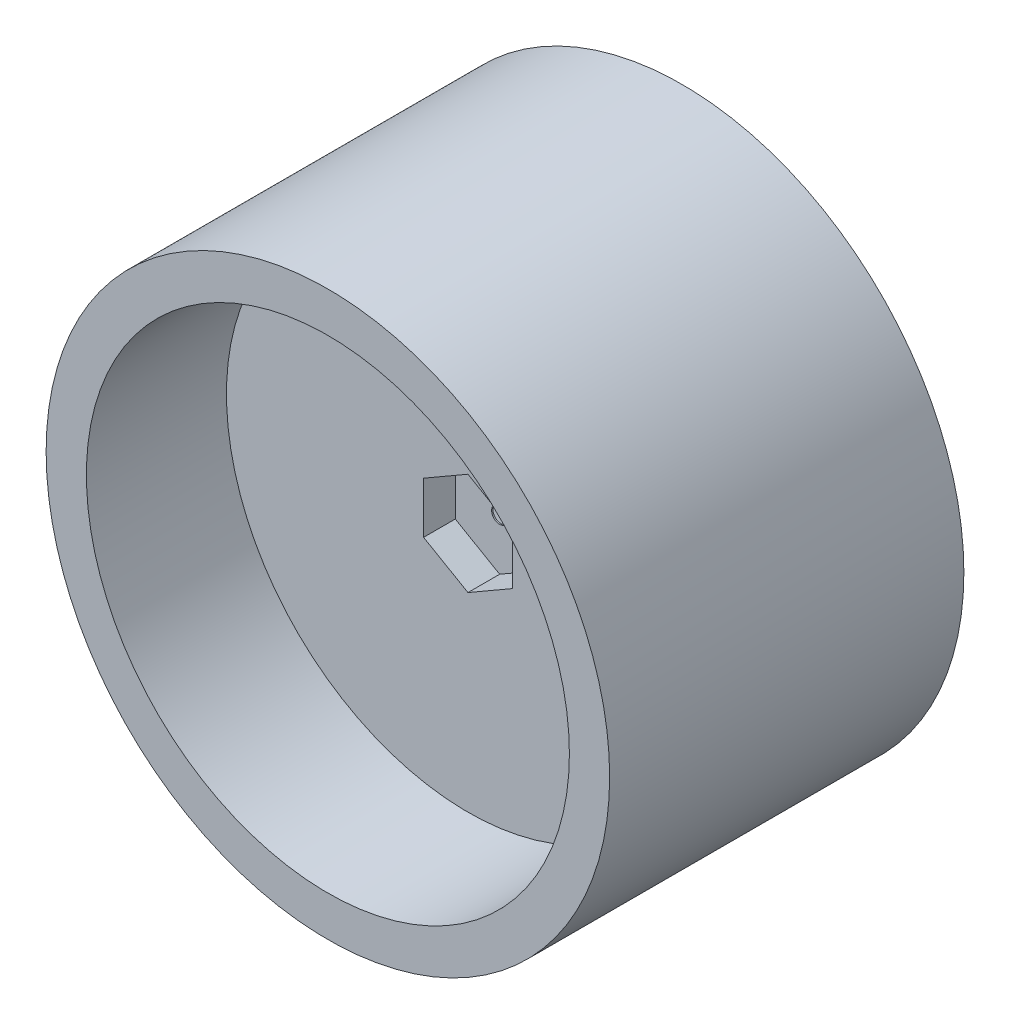
ISO-10303-21;
HEADER;
FILE_DESCRIPTION(('STEP AP214'),'2;1');
FILE_NAME('part.step','',(''),(''),'','','');
FILE_SCHEMA(('AUTOMOTIVE_DESIGN { 1 0 10303 214 1 1 1 1 }'));
ENDSEC;
DATA;
#1=APPLICATION_CONTEXT('core data for automotive mechanical design processes');
#2=APPLICATION_PROTOCOL_DEFINITION('international standard','automotive_design',2000,#1);
#3=PRODUCT_CONTEXT('',#1,'mechanical');
#4=PRODUCT('Part','Part','',(#3));
#5=PRODUCT_RELATED_PRODUCT_CATEGORY('part','',(#4));
#6=PRODUCT_DEFINITION_FORMATION('','',#4);
#7=PRODUCT_DEFINITION_CONTEXT('part definition',#1,'design');
#8=PRODUCT_DEFINITION('design','',#6,#7);
#9=PRODUCT_DEFINITION_SHAPE('','',#8);
#10=(LENGTH_UNIT() NAMED_UNIT(*) SI_UNIT(.MILLI.,.METRE.));
#11=(NAMED_UNIT(*) PLANE_ANGLE_UNIT() SI_UNIT($,.RADIAN.));
#12=(NAMED_UNIT(*) SI_UNIT($,.STERADIAN.) SOLID_ANGLE_UNIT());
#13=UNCERTAINTY_MEASURE_WITH_UNIT(LENGTH_MEASURE(1.E-05),#10,'distance_accuracy_value','');
#14=(GEOMETRIC_REPRESENTATION_CONTEXT(3) GLOBAL_UNCERTAINTY_ASSIGNED_CONTEXT((#13)) GLOBAL_UNIT_ASSIGNED_CONTEXT((#10,
#11,#12)) REPRESENTATION_CONTEXT('',''));
#15=CARTESIAN_POINT('',(0.,0.,0.));
#16=DIRECTION('',(0.,0.,1.));
#17=DIRECTION('',(1.,0.,0.));
#18=AXIS2_PLACEMENT_3D('',#15,#16,#17);
#19=CARTESIAN_POINT('',(0.,0.,0.));
#20=DIRECTION('',(0.,0.,1.));
#21=DIRECTION('',(1.,0.,0.));
#22=AXIS2_PLACEMENT_3D('',#19,#20,#21);
#23=CYLINDRICAL_SURFACE('',#22,1.27);
#24=CARTESIAN_POINT('',(0.,0.,28.575));
#25=DIRECTION('',(0.,0.,-1.));
#26=DIRECTION('',(-1.,0.,0.));
#27=AXIS2_PLACEMENT_3D('',#24,#25,#26);
#28=CIRCLE('',#27,1.27);
#29=CARTESIAN_POINT('',(-1.27,0.,28.575));
#30=VERTEX_POINT('',#29);
#31=EDGE_CURVE('E148',#30,#30,#28,.T.);
#32=ORIENTED_EDGE('',*,*,#31,.T.);
#33=EDGE_LOOP('',(#32));
#34=FACE_BOUND('',#33,.T.);
#35=CARTESIAN_POINT('',(0.,0.,28.782));
#36=DIRECTION('',(0.,0.,1.));
#37=DIRECTION('',(1.,0.,0.));
#38=AXIS2_PLACEMENT_3D('',#35,#36,#37);
#39=CIRCLE('',#38,1.27);
#40=CARTESIAN_POINT('',(1.27,0.,28.782));
#41=VERTEX_POINT('',#40);
#42=EDGE_CURVE('E35',#41,#41,#39,.F.);
#43=ORIENTED_EDGE('',*,*,#42,.F.);
#44=EDGE_LOOP('',(#43));
#45=FACE_BOUND('',#44,.T.);
#46=ADVANCED_FACE('F31',(#34,#45),#23,.F.);
#47=CARTESIAN_POINT('',(0.,0.,55.88));
#48=DIRECTION('',(0.,0.,-1.));
#49=DIRECTION('',(-1.,0.,0.));
#50=AXIS2_PLACEMENT_3D('',#47,#48,#49);
#51=CYLINDRICAL_SURFACE('',#50,44.45);
#52=CARTESIAN_POINT('',(0.,0.,55.88));
#53=DIRECTION('',(0.,0.,1.));
#54=DIRECTION('',(1.,0.,0.));
#55=AXIS2_PLACEMENT_3D('',#52,#53,#54);
#56=CIRCLE('',#55,44.45);
#57=CARTESIAN_POINT('',(44.45,0.,55.88));
#58=VERTEX_POINT('',#57);
#59=EDGE_CURVE('E11',#58,#58,#56,.T.);
#60=ORIENTED_EDGE('',*,*,#59,.F.);
#61=EDGE_LOOP('',(#60));
#62=FACE_BOUND('',#61,.T.);
#63=CARTESIAN_POINT('',(0.,0.,0.));
#64=DIRECTION('',(0.,0.,1.));
#65=DIRECTION('',(1.,0.,0.));
#66=AXIS2_PLACEMENT_3D('',#63,#64,#65);
#67=CIRCLE('',#66,44.45);
#68=CARTESIAN_POINT('',(44.45,0.,0.));
#69=VERTEX_POINT('',#68);
#70=EDGE_CURVE('E40',#69,#69,#67,.T.);
#71=ORIENTED_EDGE('',*,*,#70,.T.);
#72=EDGE_LOOP('',(#71));
#73=FACE_BOUND('',#72,.T.);
#74=ADVANCED_FACE('F33',(#62,#73),#51,.T.);
#75=CARTESIAN_POINT('',(0.,0.,55.88));
#76=DIRECTION('',(0.,0.,1.));
#77=DIRECTION('',(1.,0.,0.));
#78=AXIS2_PLACEMENT_3D('',#75,#76,#77);
#79=PLANE('',#78);
#80=CARTESIAN_POINT('',(0.,0.,55.88));
#81=DIRECTION('',(0.,0.,1.));
#82=DIRECTION('',(1.,0.,0.));
#83=AXIS2_PLACEMENT_3D('',#80,#81,#82);
#84=CIRCLE('',#83,38.1);
#85=CARTESIAN_POINT('',(38.1,0.,55.88));
#86=VERTEX_POINT('',#85);
#87=EDGE_CURVE('E144',#86,#86,#84,.T.);
#88=ORIENTED_EDGE('',*,*,#87,.F.);
#89=EDGE_LOOP('',(#88));
#90=FACE_BOUND('',#89,.T.);
#91=ORIENTED_EDGE('',*,*,#59,.T.);
#92=EDGE_LOOP('',(#91));
#93=FACE_BOUND('',#92,.T.);
#94=ADVANCED_FACE('F168',(#90,#93),#79,.T.);
#95=CARTESIAN_POINT('',(0.,0.,0.));
#96=DIRECTION('',(0.,0.,1.));
#97=DIRECTION('',(1.,0.,0.));
#98=AXIS2_PLACEMENT_3D('',#95,#96,#97);
#99=PLANE('',#98);
#100=CARTESIAN_POINT('',(0.,0.,0.));
#101=DIRECTION('',(0.,0.,-1.));
#102=DIRECTION('',(-1.,0.,0.));
#103=AXIS2_PLACEMENT_3D('',#100,#101,#102);
#104=CIRCLE('',#103,38.1);
#105=CARTESIAN_POINT('',(-38.1,0.,0.));
#106=VERTEX_POINT('',#105);
#107=EDGE_CURVE('E145',#106,#106,#104,.T.);
#108=ORIENTED_EDGE('',*,*,#107,.F.);
#109=EDGE_LOOP('',(#108));
#110=FACE_BOUND('',#109,.T.);
#111=ORIENTED_EDGE('',*,*,#70,.F.);
#112=EDGE_LOOP('',(#111));
#113=FACE_BOUND('',#112,.T.);
#114=ADVANCED_FACE('F187',(#110,#113),#99,.F.);
#115=CARTESIAN_POINT('',(0.,0.,33.782));
#116=DIRECTION('',(0.,0.,1.));
#117=DIRECTION('',(1.,0.,0.));
#118=AXIS2_PLACEMENT_3D('',#115,#116,#117);
#119=CYLINDRICAL_SURFACE('',#118,38.1);
#120=CARTESIAN_POINT('',(0.,0.,33.782));
#121=DIRECTION('',(0.,0.,1.));
#122=DIRECTION('',(1.,0.,0.));
#123=AXIS2_PLACEMENT_3D('',#120,#121,#122);
#124=CIRCLE('',#123,38.1);
#125=CARTESIAN_POINT('',(38.1,0.,33.782));
#126=VERTEX_POINT('',#125);
#127=EDGE_CURVE('E149',#126,#126,#124,.T.);
#128=ORIENTED_EDGE('',*,*,#127,.F.);
#129=EDGE_LOOP('',(#128));
#130=FACE_BOUND('',#129,.T.);
#131=ORIENTED_EDGE('',*,*,#87,.T.);
#132=EDGE_LOOP('',(#131));
#133=FACE_BOUND('',#132,.T.);
#134=ADVANCED_FACE('F183',(#130,#133),#119,.F.);
#135=CARTESIAN_POINT('',(0.,0.,33.782));
#136=DIRECTION('',(0.,0.,1.));
#137=DIRECTION('',(1.,0.,0.));
#138=AXIS2_PLACEMENT_3D('',#135,#136,#137);
#139=PLANE('',#138);
#140=DIRECTION('',(-0.866025403784439,0.5,0.));
#141=VECTOR('',#140,1.);
#142=CARTESIAN_POINT('',(7.,4.04145188432738,33.782));
#143=LINE('',#142,#141);
#144=CARTESIAN_POINT('',(7.,4.04145188432738,33.782));
#145=VERTEX_POINT('',#144);
#146=CARTESIAN_POINT('',(0.,8.08290376865477,33.782));
#147=VERTEX_POINT('',#146);
#148=EDGE_CURVE('E48',#145,#147,#143,.T.);
#149=ORIENTED_EDGE('',*,*,#148,.F.);
#150=DIRECTION('',(0.,1.,0.));
#151=VECTOR('',#150,1.);
#152=CARTESIAN_POINT('',(7.,-4.04145188432738,33.782));
#153=LINE('',#152,#151);
#154=CARTESIAN_POINT('',(7.,-4.04145188432738,33.782));
#155=VERTEX_POINT('',#154);
#156=EDGE_CURVE('E132',#155,#145,#153,.T.);
#157=ORIENTED_EDGE('',*,*,#156,.F.);
#158=DIRECTION('',(0.866025403784438,0.5,0.));
#159=VECTOR('',#158,1.);
#160=CARTESIAN_POINT('',(0.,-8.08290376865476,33.782));
#161=LINE('',#160,#159);
#162=CARTESIAN_POINT('',(0.,-8.08290376865476,33.782));
#163=VERTEX_POINT('',#162);
#164=EDGE_CURVE('E130',#163,#155,#161,.T.);
#165=ORIENTED_EDGE('',*,*,#164,.F.);
#166=DIRECTION('',(0.866025403784438,-0.5,0.));
#167=VECTOR('',#166,1.);
#168=CARTESIAN_POINT('',(-7.,-4.04145188432738,33.782));
#169=LINE('',#168,#167);
#170=CARTESIAN_POINT('',(-7.,-4.04145188432738,33.782));
#171=VERTEX_POINT('',#170);
#172=EDGE_CURVE('E96',#171,#163,#169,.T.);
#173=ORIENTED_EDGE('',*,*,#172,.F.);
#174=DIRECTION('',(0.,-1.,0.));
#175=VECTOR('',#174,1.);
#176=CARTESIAN_POINT('',(-7.,4.04145188432738,33.782));
#177=LINE('',#176,#175);
#178=CARTESIAN_POINT('',(-7.,4.04145188432738,33.782));
#179=VERTEX_POINT('',#178);
#180=EDGE_CURVE('E126',#179,#171,#177,.T.);
#181=ORIENTED_EDGE('',*,*,#180,.F.);
#182=DIRECTION('',(-0.866025403784439,-0.5,0.));
#183=VECTOR('',#182,1.);
#184=CARTESIAN_POINT('',(0.,8.08290376865476,33.782));
#185=LINE('',#184,#183);
#186=EDGE_CURVE('E123',#147,#179,#185,.T.);
#187=ORIENTED_EDGE('',*,*,#186,.F.);
#188=EDGE_LOOP('',(#149,#157,#165,#173,#181,#187));
#189=FACE_BOUND('',#188,.T.);
#190=ORIENTED_EDGE('',*,*,#127,.T.);
#191=EDGE_LOOP('',(#190));
#192=FACE_BOUND('',#191,.T.);
#193=ADVANCED_FACE('F180',(#189,#192),#139,.T.);
#194=CARTESIAN_POINT('',(0.,0.,28.575));
#195=DIRECTION('',(0.,0.,-1.));
#196=DIRECTION('',(-1.,0.,0.));
#197=AXIS2_PLACEMENT_3D('',#194,#195,#196);
#198=CYLINDRICAL_SURFACE('',#197,38.1);
#199=CARTESIAN_POINT('',(0.,0.,28.575));
#200=DIRECTION('',(0.,0.,-1.));
#201=DIRECTION('',(-1.,0.,0.));
#202=AXIS2_PLACEMENT_3D('',#199,#200,#201);
#203=CIRCLE('',#202,38.1);
#204=CARTESIAN_POINT('',(-38.1,0.,28.575));
#205=VERTEX_POINT('',#204);
#206=EDGE_CURVE('E141',#205,#205,#203,.T.);
#207=ORIENTED_EDGE('',*,*,#206,.F.);
#208=EDGE_LOOP('',(#207));
#209=FACE_BOUND('',#208,.T.);
#210=ORIENTED_EDGE('',*,*,#107,.T.);
#211=EDGE_LOOP('',(#210));
#212=FACE_BOUND('',#211,.T.);
#213=ADVANCED_FACE('F176',(#209,#212),#198,.F.);
#214=CARTESIAN_POINT('',(0.,0.,28.575));
#215=DIRECTION('',(0.,0.,-1.));
#216=DIRECTION('',(-1.,0.,0.));
#217=AXIS2_PLACEMENT_3D('',#214,#215,#216);
#218=PLANE('',#217);
#219=ORIENTED_EDGE('',*,*,#31,.F.);
#220=EDGE_LOOP('',(#219));
#221=FACE_BOUND('',#220,.T.);
#222=ORIENTED_EDGE('',*,*,#206,.T.);
#223=EDGE_LOOP('',(#222));
#224=FACE_BOUND('',#223,.T.);
#225=ADVANCED_FACE('F174',(#221,#224),#218,.T.);
#226=CARTESIAN_POINT('',(0.,8.08290376865476,28.782));
#227=DIRECTION('',(0.,0.,1.));
#228=DIRECTION('',(1.,0.,0.));
#229=AXIS2_PLACEMENT_3D('',#226,#227,#228);
#230=PLANE('',#229);
#231=DIRECTION('',(-0.866025403784439,0.5,0.));
#232=VECTOR('',#231,1.);
#233=CARTESIAN_POINT('',(7.,4.04145188432738,28.782));
#234=LINE('',#233,#232);
#235=CARTESIAN_POINT('',(7.,4.04145188432738,28.782));
#236=VERTEX_POINT('',#235);
#237=CARTESIAN_POINT('',(0.,8.08290376865476,28.782));
#238=VERTEX_POINT('',#237);
#239=EDGE_CURVE('E134',#236,#238,#234,.T.);
#240=ORIENTED_EDGE('',*,*,#239,.T.);
#241=DIRECTION('',(-0.866025403784439,-0.5,0.));
#242=VECTOR('',#241,1.);
#243=CARTESIAN_POINT('',(0.,8.08290376865476,28.782));
#244=LINE('',#243,#242);
#245=CARTESIAN_POINT('',(-7.,4.04145188432738,28.782));
#246=VERTEX_POINT('',#245);
#247=EDGE_CURVE('E117',#238,#246,#244,.T.);
#248=ORIENTED_EDGE('',*,*,#247,.T.);
#249=DIRECTION('',(0.,-1.,0.));
#250=VECTOR('',#249,1.);
#251=CARTESIAN_POINT('',(-7.,4.04145188432738,28.782));
#252=LINE('',#251,#250);
#253=CARTESIAN_POINT('',(-7.,-4.04145188432738,28.782));
#254=VERTEX_POINT('',#253);
#255=EDGE_CURVE('E115',#246,#254,#252,.T.);
#256=ORIENTED_EDGE('',*,*,#255,.T.);
#257=DIRECTION('',(0.866025403784438,-0.5,0.));
#258=VECTOR('',#257,1.);
#259=CARTESIAN_POINT('',(-7.,-4.04145188432738,28.782));
#260=LINE('',#259,#258);
#261=CARTESIAN_POINT('',(0.,-8.08290376865476,28.782));
#262=VERTEX_POINT('',#261);
#263=EDGE_CURVE('E93',#254,#262,#260,.T.);
#264=ORIENTED_EDGE('',*,*,#263,.T.);
#265=DIRECTION('',(0.866025403784438,0.5,0.));
#266=VECTOR('',#265,1.);
#267=CARTESIAN_POINT('',(0.,-8.08290376865476,28.782));
#268=LINE('',#267,#266);
#269=CARTESIAN_POINT('',(7.,-4.04145188432738,28.782));
#270=VERTEX_POINT('',#269);
#271=EDGE_CURVE('E104',#262,#270,#268,.T.);
#272=ORIENTED_EDGE('',*,*,#271,.T.);
#273=DIRECTION('',(0.,1.,0.));
#274=VECTOR('',#273,1.);
#275=CARTESIAN_POINT('',(7.,-4.04145188432738,28.782));
#276=LINE('',#275,#274);
#277=EDGE_CURVE('E108',#270,#236,#276,.T.);
#278=ORIENTED_EDGE('',*,*,#277,.T.);
#279=EDGE_LOOP('',(#240,#248,#256,#264,#272,#278));
#280=FACE_BOUND('',#279,.T.);
#281=ORIENTED_EDGE('',*,*,#42,.T.);
#282=EDGE_LOOP('',(#281));
#283=FACE_BOUND('',#282,.T.);
#284=ADVANCED_FACE('F111',(#280,#283),#230,.T.);
#285=CARTESIAN_POINT('',(7.,4.04145188432738,28.782));
#286=DIRECTION('',(0.5,0.866025403784439,0.));
#287=DIRECTION('',(-0.866025403784439,0.5,0.));
#288=AXIS2_PLACEMENT_3D('',#285,#286,#287);
#289=PLANE('',#288);
#290=ORIENTED_EDGE('',*,*,#148,.T.);
#291=DIRECTION('',(0.,0.,1.));
#292=VECTOR('',#291,1.);
#293=CARTESIAN_POINT('',(0.,8.08290376865476,28.782));
#294=LINE('',#293,#292);
#295=EDGE_CURVE('E78',#238,#147,#294,.T.);
#296=ORIENTED_EDGE('',*,*,#295,.F.);
#297=ORIENTED_EDGE('',*,*,#239,.F.);
#298=DIRECTION('',(0.,0.,1.));
#299=VECTOR('',#298,1.);
#300=CARTESIAN_POINT('',(7.,4.04145188432738,28.782));
#301=LINE('',#300,#299);
#302=EDGE_CURVE('E56',#236,#145,#301,.T.);
#303=ORIENTED_EDGE('',*,*,#302,.T.);
#304=EDGE_LOOP('',(#290,#296,#297,#303));
#305=FACE_BOUND('',#304,.T.);
#306=ADVANCED_FACE('F172',(#305),#289,.F.);
#307=CARTESIAN_POINT('',(7.,-4.04145188432738,28.782));
#308=DIRECTION('',(1.,0.,0.));
#309=DIRECTION('',(0.,1.,0.));
#310=AXIS2_PLACEMENT_3D('',#307,#308,#309);
#311=PLANE('',#310);
#312=ORIENTED_EDGE('',*,*,#156,.T.);
#313=ORIENTED_EDGE('',*,*,#302,.F.);
#314=ORIENTED_EDGE('',*,*,#277,.F.);
#315=DIRECTION('',(0.,0.,1.));
#316=VECTOR('',#315,1.);
#317=CARTESIAN_POINT('',(7.,-4.04145188432738,28.782));
#318=LINE('',#317,#316);
#319=EDGE_CURVE('E100',#270,#155,#318,.T.);
#320=ORIENTED_EDGE('',*,*,#319,.T.);
#321=EDGE_LOOP('',(#312,#313,#314,#320));
#322=FACE_BOUND('',#321,.T.);
#323=ADVANCED_FACE('F238',(#322),#311,.F.);
#324=CARTESIAN_POINT('',(0.,-8.08290376865476,28.782));
#325=DIRECTION('',(0.5,-0.866025403784438,0.));
#326=DIRECTION('',(0.866025403784439,0.5,0.));
#327=AXIS2_PLACEMENT_3D('',#324,#325,#326);
#328=PLANE('',#327);
#329=ORIENTED_EDGE('',*,*,#164,.T.);
#330=ORIENTED_EDGE('',*,*,#319,.F.);
#331=ORIENTED_EDGE('',*,*,#271,.F.);
#332=DIRECTION('',(0.,0.,1.));
#333=VECTOR('',#332,1.);
#334=CARTESIAN_POINT('',(0.,-8.08290376865476,28.782));
#335=LINE('',#334,#333);
#336=EDGE_CURVE('E89',#262,#163,#335,.T.);
#337=ORIENTED_EDGE('',*,*,#336,.T.);
#338=EDGE_LOOP('',(#329,#330,#331,#337));
#339=FACE_BOUND('',#338,.T.);
#340=ADVANCED_FACE('F105',(#339),#328,.F.);
#341=CARTESIAN_POINT('',(-7.,-4.04145188432738,28.782));
#342=DIRECTION('',(-0.5,-0.866025403784438,0.));
#343=DIRECTION('',(0.866025403784438,-0.5,0.));
#344=AXIS2_PLACEMENT_3D('',#341,#342,#343);
#345=PLANE('',#344);
#346=ORIENTED_EDGE('',*,*,#172,.T.);
#347=ORIENTED_EDGE('',*,*,#336,.F.);
#348=ORIENTED_EDGE('',*,*,#263,.F.);
#349=DIRECTION('',(0.,0.,1.));
#350=VECTOR('',#349,1.);
#351=CARTESIAN_POINT('',(-7.,-4.04145188432738,28.782));
#352=LINE('',#351,#350);
#353=EDGE_CURVE('E101',#254,#171,#352,.T.);
#354=ORIENTED_EDGE('',*,*,#353,.T.);
#355=EDGE_LOOP('',(#346,#347,#348,#354));
#356=FACE_BOUND('',#355,.T.);
#357=ADVANCED_FACE('F91',(#356),#345,.F.);
#358=CARTESIAN_POINT('',(-7.,4.04145188432738,28.782));
#359=DIRECTION('',(-1.,0.,0.));
#360=DIRECTION('',(0.,-1.,0.));
#361=AXIS2_PLACEMENT_3D('',#358,#359,#360);
#362=PLANE('',#361);
#363=ORIENTED_EDGE('',*,*,#180,.T.);
#364=ORIENTED_EDGE('',*,*,#353,.F.);
#365=ORIENTED_EDGE('',*,*,#255,.F.);
#366=DIRECTION('',(0.,0.,1.));
#367=VECTOR('',#366,1.);
#368=CARTESIAN_POINT('',(-7.,4.04145188432738,28.782));
#369=LINE('',#368,#367);
#370=EDGE_CURVE('E138',#246,#179,#369,.T.);
#371=ORIENTED_EDGE('',*,*,#370,.T.);
#372=EDGE_LOOP('',(#363,#364,#365,#371));
#373=FACE_BOUND('',#372,.T.);
#374=ADVANCED_FACE('F256',(#373),#362,.F.);
#375=CARTESIAN_POINT('',(0.,8.08290376865476,28.782));
#376=DIRECTION('',(-0.5,0.866025403784439,0.));
#377=DIRECTION('',(-0.866025403784439,-0.5,0.));
#378=AXIS2_PLACEMENT_3D('',#375,#376,#377);
#379=PLANE('',#378);
#380=ORIENTED_EDGE('',*,*,#186,.T.);
#381=ORIENTED_EDGE('',*,*,#370,.F.);
#382=ORIENTED_EDGE('',*,*,#247,.F.);
#383=ORIENTED_EDGE('',*,*,#295,.T.);
#384=EDGE_LOOP('',(#380,#381,#382,#383));
#385=FACE_BOUND('',#384,.T.);
#386=ADVANCED_FACE('F263',(#385),#379,.F.);
#387=CLOSED_SHELL('',(#46,#74,#94,#114,#134,#193,#213,#225,#284,#306,#323,#340,#357,#374,#386));
#388=MANIFOLD_SOLID_BREP('B2',#387);
#389=ADVANCED_BREP_SHAPE_REPRESENTATION('',(#18,#388),#14);
#390=SHAPE_DEFINITION_REPRESENTATION(#9,#389);
ENDSEC;
END-ISO-10303-21;
